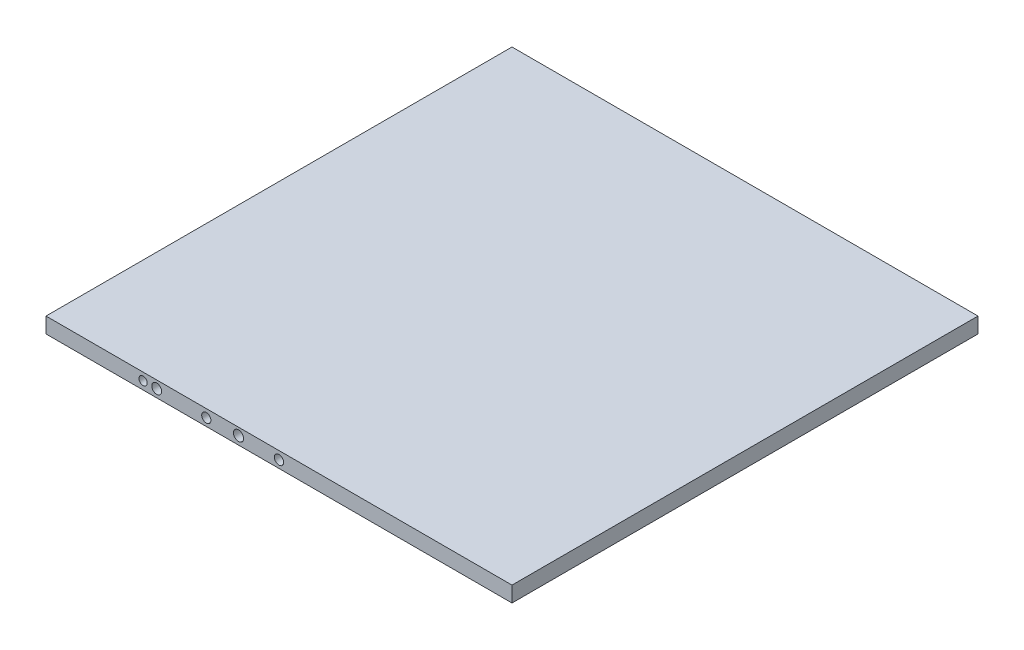
ISO-10303-21;
HEADER;
FILE_DESCRIPTION(('STEP AP214'),'2;1');
FILE_NAME('part.step','',(''),(''),'','','');
FILE_SCHEMA(('AUTOMOTIVE_DESIGN { 1 0 10303 214 1 1 1 1 }'));
ENDSEC;
DATA;
#1=APPLICATION_CONTEXT('core data for automotive mechanical design processes');
#2=APPLICATION_PROTOCOL_DEFINITION('international standard','automotive_design',2000,#1);
#3=PRODUCT_CONTEXT('',#1,'mechanical');
#4=PRODUCT('Part','Part','',(#3));
#5=PRODUCT_RELATED_PRODUCT_CATEGORY('part','',(#4));
#6=PRODUCT_DEFINITION_FORMATION('','',#4);
#7=PRODUCT_DEFINITION_CONTEXT('part definition',#1,'design');
#8=PRODUCT_DEFINITION('design','',#6,#7);
#9=PRODUCT_DEFINITION_SHAPE('','',#8);
#10=(LENGTH_UNIT() NAMED_UNIT(*) SI_UNIT(.MILLI.,.METRE.));
#11=(NAMED_UNIT(*) PLANE_ANGLE_UNIT() SI_UNIT($,.RADIAN.));
#12=(NAMED_UNIT(*) SI_UNIT($,.STERADIAN.) SOLID_ANGLE_UNIT());
#13=UNCERTAINTY_MEASURE_WITH_UNIT(LENGTH_MEASURE(1.E-05),#10,'distance_accuracy_value','');
#14=(GEOMETRIC_REPRESENTATION_CONTEXT(3) GLOBAL_UNCERTAINTY_ASSIGNED_CONTEXT((#13)) GLOBAL_UNIT_ASSIGNED_CONTEXT((#10,
#11,#12)) REPRESENTATION_CONTEXT('',''));
#15=CARTESIAN_POINT('',(0.,0.,0.));
#16=DIRECTION('',(0.,0.,1.));
#17=DIRECTION('',(1.,0.,0.));
#18=AXIS2_PLACEMENT_3D('',#15,#16,#17);
#19=CARTESIAN_POINT('',(-159.521495327103,10.16,-154.299065420561));
#20=DIRECTION('',(1.,0.,0.));
#21=DIRECTION('',(0.,0.,-1.));
#22=AXIS2_PLACEMENT_3D('',#19,#20,#21);
#23=PLANE('',#22);
#24=DIRECTION('',(0.,0.,1.));
#25=VECTOR('',#24,1.);
#26=CARTESIAN_POINT('',(-159.521495327103,0.,-154.299065420561));
#27=LINE('',#26,#25);
#28=CARTESIAN_POINT('',(-159.521495327103,0.,-154.299065420561));
#29=VERTEX_POINT('',#28);
#30=CARTESIAN_POINT('',(-159.521495327103,0.,150.500934579439));
#31=VERTEX_POINT('',#30);
#32=EDGE_CURVE('E99',#29,#31,#27,.T.);
#33=ORIENTED_EDGE('',*,*,#32,.T.);
#34=DIRECTION('',(0.,-1.,0.));
#35=VECTOR('',#34,1.);
#36=CARTESIAN_POINT('',(-159.521495327103,10.16,150.500934579439));
#37=LINE('',#36,#35);
#38=CARTESIAN_POINT('',(-159.521495327103,10.16,150.500934579439));
#39=VERTEX_POINT('',#38);
#40=EDGE_CURVE('E11',#39,#31,#37,.T.);
#41=ORIENTED_EDGE('',*,*,#40,.F.);
#42=DIRECTION('',(0.,0.,1.));
#43=VECTOR('',#42,1.);
#44=CARTESIAN_POINT('',(-159.521495327103,10.16,-154.299065420561));
#45=LINE('',#44,#43);
#46=CARTESIAN_POINT('',(-159.521495327103,10.16,-154.299065420561));
#47=VERTEX_POINT('',#46);
#48=EDGE_CURVE('E87',#47,#39,#45,.T.);
#49=ORIENTED_EDGE('',*,*,#48,.F.);
#50=DIRECTION('',(0.,-1.,0.));
#51=VECTOR('',#50,1.);
#52=CARTESIAN_POINT('',(-159.521495327103,10.16,-154.299065420561));
#53=LINE('',#52,#51);
#54=EDGE_CURVE('E95',#47,#29,#53,.T.);
#55=ORIENTED_EDGE('',*,*,#54,.T.);
#56=EDGE_LOOP('',(#33,#41,#49,#55));
#57=FACE_BOUND('',#56,.T.);
#58=ADVANCED_FACE('F36',(#57),#23,.F.);
#59=CARTESIAN_POINT('',(-159.521495327103,10.16,150.500934579439));
#60=DIRECTION('',(0.,0.,-1.));
#61=DIRECTION('',(-1.,0.,0.));
#62=AXIS2_PLACEMENT_3D('',#59,#60,#61);
#63=PLANE('',#62);
#64=CARTESIAN_POINT('',(-96.0214953271028,5.2184036671133,150.500934579439));
#65=DIRECTION('',(0.,0.,1.));
#66=DIRECTION('',(1.,0.,0.));
#67=AXIS2_PLACEMENT_3D('',#64,#65,#66);
#68=CIRCLE('',#67,2.70457170875124);
#69=CARTESIAN_POINT('',(-93.3169236183516,5.2184036671133,150.500934579439));
#70=VERTEX_POINT('',#69);
#71=EDGE_CURVE('E137',#70,#70,#68,.T.);
#72=ORIENTED_EDGE('',*,*,#71,.F.);
#73=EDGE_LOOP('',(#72));
#74=FACE_BOUND('',#73,.T.);
#75=CARTESIAN_POINT('',(-54.6794852296002,4.94175002935322,150.500934579439));
#76=DIRECTION('',(0.,0.,-1.));
#77=DIRECTION('',(-1.,0.,0.));
#78=AXIS2_PLACEMENT_3D('',#75,#76,#77);
#79=CIRCLE('',#78,3.);
#80=CARTESIAN_POINT('',(-51.6794852296002,4.94175002935322,150.500934579439));
#81=VERTEX_POINT('',#80);
#82=EDGE_CURVE('E130',#81,#81,#79,.T.);
#83=ORIENTED_EDGE('',*,*,#82,.T.);
#84=EDGE_LOOP('',(#83));
#85=FACE_BOUND('',#84,.T.);
#86=CARTESIAN_POINT('',(-33.5863044019541,5.33446931802849,150.500934579439));
#87=DIRECTION('',(0.,0.,-1.));
#88=DIRECTION('',(-1.,0.,0.));
#89=AXIS2_PLACEMENT_3D('',#86,#87,#88);
#90=CIRCLE('',#89,3.30810113435642);
#91=CARTESIAN_POINT('',(-30.2782032675976,5.33446931802849,150.500934579439));
#92=VERTEX_POINT('',#91);
#93=EDGE_CURVE('E122',#92,#92,#90,.T.);
#94=ORIENTED_EDGE('',*,*,#93,.T.);
#95=EDGE_LOOP('',(#94));
#96=FACE_BOUND('',#95,.T.);
#97=CARTESIAN_POINT('',(-87.1188149179639,5.2184036671133,150.500934579439));
#98=DIRECTION('',(0.,0.,1.));
#99=DIRECTION('',(1.,0.,0.));
#100=AXIS2_PLACEMENT_3D('',#97,#98,#99);
#101=CIRCLE('',#100,3.22810050000606);
#102=CARTESIAN_POINT('',(-83.8907144179578,5.2184036671133,150.500934579439));
#103=VERTEX_POINT('',#102);
#104=EDGE_CURVE('E119',#103,#103,#101,.T.);
#105=ORIENTED_EDGE('',*,*,#104,.F.);
#106=EDGE_LOOP('',(#105));
#107=FACE_BOUND('',#106,.T.);
#108=CARTESIAN_POINT('',(-7.12149532710285,4.94175002935322,150.500934579439));
#109=DIRECTION('',(0.,0.,1.));
#110=DIRECTION('',(1.,0.,0.));
#111=AXIS2_PLACEMENT_3D('',#108,#109,#110);
#112=CIRCLE('',#111,3.04);
#113=CARTESIAN_POINT('',(-4.08149532710285,4.94175002935322,150.500934579439));
#114=VERTEX_POINT('',#113);
#115=EDGE_CURVE('E115',#114,#114,#112,.T.);
#116=ORIENTED_EDGE('',*,*,#115,.F.);
#117=EDGE_LOOP('',(#116));
#118=FACE_BOUND('',#117,.T.);
#119=DIRECTION('',(1.,0.,0.));
#120=VECTOR('',#119,1.);
#121=CARTESIAN_POINT('',(-159.521495327103,0.,150.500934579439));
#122=LINE('',#121,#120);
#123=CARTESIAN_POINT('',(145.278504672897,0.,150.500934579439));
#124=VERTEX_POINT('',#123);
#125=EDGE_CURVE('E91',#31,#124,#122,.T.);
#126=ORIENTED_EDGE('',*,*,#125,.T.);
#127=DIRECTION('',(0.,-1.,0.));
#128=VECTOR('',#127,1.);
#129=CARTESIAN_POINT('',(145.278504672897,10.16,150.500934579439));
#130=LINE('',#129,#128);
#131=CARTESIAN_POINT('',(145.278504672897,10.16,150.500934579439));
#132=VERTEX_POINT('',#131);
#133=EDGE_CURVE('E44',#132,#124,#130,.T.);
#134=ORIENTED_EDGE('',*,*,#133,.F.);
#135=DIRECTION('',(1.,0.,0.));
#136=VECTOR('',#135,1.);
#137=CARTESIAN_POINT('',(-159.521495327103,10.16,150.500934579439));
#138=LINE('',#137,#136);
#139=EDGE_CURVE('E82',#39,#132,#138,.T.);
#140=ORIENTED_EDGE('',*,*,#139,.F.);
#141=ORIENTED_EDGE('',*,*,#40,.T.);
#142=EDGE_LOOP('',(#126,#134,#140,#141));
#143=FACE_BOUND('',#142,.T.);
#144=ADVANCED_FACE('F90',(#74,#85,#96,#107,#118,#143),#63,.F.);
#145=CARTESIAN_POINT('',(145.278504672897,10.16,-154.299065420561));
#146=DIRECTION('',(-1.,0.,0.));
#147=DIRECTION('',(0.,0.,1.));
#148=AXIS2_PLACEMENT_3D('',#145,#146,#147);
#149=PLANE('',#148);
#150=DIRECTION('',(0.,0.,-1.));
#151=VECTOR('',#150,1.);
#152=CARTESIAN_POINT('',(145.278504672897,0.,-154.299065420561));
#153=LINE('',#152,#151);
#154=CARTESIAN_POINT('',(145.278504672897,0.,-154.299065420561));
#155=VERTEX_POINT('',#154);
#156=EDGE_CURVE('E69',#124,#155,#153,.T.);
#157=ORIENTED_EDGE('',*,*,#156,.T.);
#158=DIRECTION('',(0.,-1.,0.));
#159=VECTOR('',#158,1.);
#160=CARTESIAN_POINT('',(145.278504672897,10.16,-154.299065420561));
#161=LINE('',#160,#159);
#162=CARTESIAN_POINT('',(145.278504672897,10.16,-154.299065420561));
#163=VERTEX_POINT('',#162);
#164=EDGE_CURVE('E92',#163,#155,#161,.T.);
#165=ORIENTED_EDGE('',*,*,#164,.F.);
#166=DIRECTION('',(0.,0.,-1.));
#167=VECTOR('',#166,1.);
#168=CARTESIAN_POINT('',(145.278504672897,10.16,-154.299065420561));
#169=LINE('',#168,#167);
#170=EDGE_CURVE('E85',#132,#163,#169,.T.);
#171=ORIENTED_EDGE('',*,*,#170,.F.);
#172=ORIENTED_EDGE('',*,*,#133,.T.);
#173=EDGE_LOOP('',(#157,#165,#171,#172));
#174=FACE_BOUND('',#173,.T.);
#175=ADVANCED_FACE('F93',(#174),#149,.F.);
#176=CARTESIAN_POINT('',(-159.521495327103,10.16,-154.299065420561));
#177=DIRECTION('',(0.,0.,1.));
#178=DIRECTION('',(1.,0.,0.));
#179=AXIS2_PLACEMENT_3D('',#176,#177,#178);
#180=PLANE('',#179);
#181=CARTESIAN_POINT('',(-96.0214953271028,5.2184036671133,-154.299065420561));
#182=DIRECTION('',(0.,0.,1.));
#183=DIRECTION('',(1.,0.,0.));
#184=AXIS2_PLACEMENT_3D('',#181,#182,#183);
#185=CIRCLE('',#184,2.70457170875124);
#186=CARTESIAN_POINT('',(-93.3169236183516,5.2184036671133,-154.299065420561));
#187=VERTEX_POINT('',#186);
#188=EDGE_CURVE('E136',#187,#187,#185,.T.);
#189=ORIENTED_EDGE('',*,*,#188,.T.);
#190=EDGE_LOOP('',(#189));
#191=FACE_BOUND('',#190,.T.);
#192=CARTESIAN_POINT('',(-54.6794852296002,4.94175002935322,-154.299065420561));
#193=DIRECTION('',(0.,0.,1.));
#194=DIRECTION('',(1.,0.,0.));
#195=AXIS2_PLACEMENT_3D('',#192,#193,#194);
#196=CIRCLE('',#195,3.);
#197=CARTESIAN_POINT('',(-51.6794852296002,4.94175002935322,-154.299065420561));
#198=VERTEX_POINT('',#197);
#199=EDGE_CURVE('E133',#198,#198,#196,.T.);
#200=ORIENTED_EDGE('',*,*,#199,.T.);
#201=EDGE_LOOP('',(#200));
#202=FACE_BOUND('',#201,.T.);
#203=CARTESIAN_POINT('',(-33.5863044019541,5.33446931802849,-154.299065420561));
#204=DIRECTION('',(0.,0.,1.));
#205=DIRECTION('',(1.,0.,0.));
#206=AXIS2_PLACEMENT_3D('',#203,#204,#205);
#207=CIRCLE('',#206,3.30810113435642);
#208=CARTESIAN_POINT('',(-30.2782032675976,5.33446931802849,-154.299065420561));
#209=VERTEX_POINT('',#208);
#210=EDGE_CURVE('E127',#209,#209,#207,.T.);
#211=ORIENTED_EDGE('',*,*,#210,.T.);
#212=EDGE_LOOP('',(#211));
#213=FACE_BOUND('',#212,.T.);
#214=CARTESIAN_POINT('',(-87.1188149179639,5.2184036671133,-154.299065420561));
#215=DIRECTION('',(0.,0.,1.));
#216=DIRECTION('',(1.,0.,0.));
#217=AXIS2_PLACEMENT_3D('',#214,#215,#216);
#218=CIRCLE('',#217,3.22810050000606);
#219=CARTESIAN_POINT('',(-83.8907144179578,5.2184036671133,-154.299065420561));
#220=VERTEX_POINT('',#219);
#221=EDGE_CURVE('E118',#220,#220,#218,.T.);
#222=ORIENTED_EDGE('',*,*,#221,.T.);
#223=EDGE_LOOP('',(#222));
#224=FACE_BOUND('',#223,.T.);
#225=CARTESIAN_POINT('',(-7.12149532710285,4.94175002935322,-154.299065420561));
#226=DIRECTION('',(0.,0.,1.));
#227=DIRECTION('',(1.,0.,0.));
#228=AXIS2_PLACEMENT_3D('',#225,#226,#227);
#229=CIRCLE('',#228,3.04);
#230=CARTESIAN_POINT('',(-4.08149532710285,4.94175002935322,-154.299065420561));
#231=VERTEX_POINT('',#230);
#232=EDGE_CURVE('E102',#231,#231,#229,.T.);
#233=ORIENTED_EDGE('',*,*,#232,.T.);
#234=EDGE_LOOP('',(#233));
#235=FACE_BOUND('',#234,.T.);
#236=DIRECTION('',(-1.,0.,0.));
#237=VECTOR('',#236,1.);
#238=CARTESIAN_POINT('',(-159.521495327103,0.,-154.299065420561));
#239=LINE('',#238,#237);
#240=EDGE_CURVE('E75',#155,#29,#239,.T.);
#241=ORIENTED_EDGE('',*,*,#240,.T.);
#242=ORIENTED_EDGE('',*,*,#54,.F.);
#243=DIRECTION('',(-1.,0.,0.));
#244=VECTOR('',#243,1.);
#245=CARTESIAN_POINT('',(-159.521495327103,10.16,-154.299065420561));
#246=LINE('',#245,#244);
#247=EDGE_CURVE('E52',#163,#47,#246,.T.);
#248=ORIENTED_EDGE('',*,*,#247,.F.);
#249=ORIENTED_EDGE('',*,*,#164,.T.);
#250=EDGE_LOOP('',(#241,#242,#248,#249));
#251=FACE_BOUND('',#250,.T.);
#252=ADVANCED_FACE('F107',(#191,#202,#213,#224,#235,#251),#180,.F.);
#253=CARTESIAN_POINT('',(0.,10.16,0.));
#254=DIRECTION('',(0.,1.,0.));
#255=DIRECTION('',(0.,0.,1.));
#256=AXIS2_PLACEMENT_3D('',#253,#254,#255);
#257=PLANE('',#256);
#258=ORIENTED_EDGE('',*,*,#48,.T.);
#259=ORIENTED_EDGE('',*,*,#139,.T.);
#260=ORIENTED_EDGE('',*,*,#170,.T.);
#261=ORIENTED_EDGE('',*,*,#247,.T.);
#262=EDGE_LOOP('',(#258,#259,#260,#261));
#263=FACE_BOUND('',#262,.T.);
#264=ADVANCED_FACE('F83',(#263),#257,.T.);
#265=CARTESIAN_POINT('',(0.,0.,0.));
#266=DIRECTION('',(0.,1.,0.));
#267=DIRECTION('',(0.,0.,1.));
#268=AXIS2_PLACEMENT_3D('',#265,#266,#267);
#269=PLANE('',#268);
#270=ORIENTED_EDGE('',*,*,#32,.F.);
#271=ORIENTED_EDGE('',*,*,#240,.F.);
#272=ORIENTED_EDGE('',*,*,#156,.F.);
#273=ORIENTED_EDGE('',*,*,#125,.F.);
#274=EDGE_LOOP('',(#270,#271,#272,#273));
#275=FACE_BOUND('',#274,.T.);
#276=ADVANCED_FACE('F110',(#275),#269,.F.);
#277=CARTESIAN_POINT('',(-7.12149532710285,4.94175002935322,-154.299065420561));
#278=DIRECTION('',(0.,0.,1.));
#279=DIRECTION('',(1.,0.,0.));
#280=AXIS2_PLACEMENT_3D('',#277,#278,#279);
#281=CYLINDRICAL_SURFACE('',#280,3.04);
#282=ORIENTED_EDGE('',*,*,#232,.F.);
#283=EDGE_LOOP('',(#282));
#284=FACE_BOUND('',#283,.T.);
#285=ORIENTED_EDGE('',*,*,#115,.T.);
#286=EDGE_LOOP('',(#285));
#287=FACE_BOUND('',#286,.T.);
#288=ADVANCED_FACE('F162',(#284,#287),#281,.F.);
#289=CARTESIAN_POINT('',(-87.1188149179639,5.2184036671133,-154.299065420561));
#290=DIRECTION('',(0.,0.,1.));
#291=DIRECTION('',(1.,0.,0.));
#292=AXIS2_PLACEMENT_3D('',#289,#290,#291);
#293=CYLINDRICAL_SURFACE('',#292,3.22810050000606);
#294=CARTESIAN_POINT('',(-83.8907144179578,5.2184036671133,-154.299065420561));
#295=CARTESIAN_POINT('',(-83.8907144179578,5.2184036671133,-151.124065420561));
#296=CARTESIAN_POINT('',(-83.8907144179578,5.2184036671133,-147.949065420561));
#297=CARTESIAN_POINT('',(-83.8907144179578,5.2184036671133,-141.599065420561));
#298=CARTESIAN_POINT('',(-83.8907144179578,5.2184036671133,-138.424065420561));
#299=CARTESIAN_POINT('',(-83.8907144179578,5.2184036671133,-132.074065420561));
#300=CARTESIAN_POINT('',(-83.8907144179578,5.2184036671133,-128.899065420561));
#301=CARTESIAN_POINT('',(-83.8907144179578,5.2184036671133,-122.549065420561));
#302=CARTESIAN_POINT('',(-83.8907144179578,5.2184036671133,-119.374065420561));
#303=CARTESIAN_POINT('',(-83.8907144179578,5.2184036671133,-113.024065420561));
#304=CARTESIAN_POINT('',(-83.8907144179578,5.2184036671133,-109.849065420561));
#305=CARTESIAN_POINT('',(-83.8907144179578,5.2184036671133,-103.499065420561));
#306=CARTESIAN_POINT('',(-83.8907144179578,5.2184036671133,-100.324065420561));
#307=CARTESIAN_POINT('',(-83.8907144179578,5.2184036671133,-93.9740654205608));
#308=CARTESIAN_POINT('',(-83.8907144179578,5.2184036671133,-90.7990654205608));
#309=CARTESIAN_POINT('',(-83.8907144179578,5.2184036671133,-84.4490654205608));
#310=CARTESIAN_POINT('',(-83.8907144179578,5.2184036671133,-81.2740654205608));
#311=CARTESIAN_POINT('',(-83.8907144179578,5.2184036671133,-74.9240654205608));
#312=CARTESIAN_POINT('',(-83.8907144179578,5.2184036671133,-71.7490654205608));
#313=CARTESIAN_POINT('',(-83.8907144179578,5.2184036671133,-65.3990654205608));
#314=CARTESIAN_POINT('',(-83.8907144179578,5.2184036671133,-62.2240654205608));
#315=CARTESIAN_POINT('',(-83.8907144179578,5.2184036671133,-55.8740654205608));
#316=CARTESIAN_POINT('',(-83.8907144179578,5.2184036671133,-52.6990654205608));
#317=CARTESIAN_POINT('',(-83.8907144179578,5.2184036671133,-46.3490654205608));
#318=CARTESIAN_POINT('',(-83.8907144179578,5.2184036671133,-43.1740654205608));
#319=CARTESIAN_POINT('',(-83.8907144179578,5.2184036671133,-36.8240654205608));
#320=CARTESIAN_POINT('',(-83.8907144179578,5.2184036671133,-33.6490654205608));
#321=CARTESIAN_POINT('',(-83.8907144179578,5.2184036671133,-27.2990654205608));
#322=CARTESIAN_POINT('',(-83.8907144179578,5.2184036671133,-24.1240654205608));
#323=CARTESIAN_POINT('',(-83.8907144179578,5.2184036671133,-17.7740654205608));
#324=CARTESIAN_POINT('',(-83.8907144179578,5.2184036671133,-14.5990654205608));
#325=CARTESIAN_POINT('',(-83.8907144179578,5.2184036671133,-8.24906542056082));
#326=CARTESIAN_POINT('',(-83.8907144179578,5.2184036671133,-5.07406542056082));
#327=CARTESIAN_POINT('',(-83.8907144179578,5.2184036671133,1.27593457943919));
#328=CARTESIAN_POINT('',(-83.8907144179578,5.2184036671133,4.45093457943919));
#329=CARTESIAN_POINT('',(-83.8907144179578,5.2184036671133,10.8009345794392));
#330=CARTESIAN_POINT('',(-83.8907144179578,5.2184036671133,13.9759345794392));
#331=CARTESIAN_POINT('',(-83.8907144179578,5.2184036671133,20.3259345794392));
#332=CARTESIAN_POINT('',(-83.8907144179578,5.2184036671133,23.5009345794392));
#333=CARTESIAN_POINT('',(-83.8907144179578,5.2184036671133,29.8509345794392));
#334=CARTESIAN_POINT('',(-83.8907144179578,5.2184036671133,33.0259345794392));
#335=CARTESIAN_POINT('',(-83.8907144179578,5.2184036671133,39.3759345794392));
#336=CARTESIAN_POINT('',(-83.8907144179578,5.2184036671133,42.5509345794392));
#337=CARTESIAN_POINT('',(-83.8907144179578,5.2184036671133,48.9009345794392));
#338=CARTESIAN_POINT('',(-83.8907144179578,5.2184036671133,52.0759345794392));
#339=CARTESIAN_POINT('',(-83.8907144179578,5.2184036671133,58.4259345794392));
#340=CARTESIAN_POINT('',(-83.8907144179578,5.2184036671133,61.6009345794392));
#341=CARTESIAN_POINT('',(-83.8907144179578,5.2184036671133,67.9509345794392));
#342=CARTESIAN_POINT('',(-83.8907144179578,5.2184036671133,71.1259345794392));
#343=CARTESIAN_POINT('',(-83.8907144179578,5.2184036671133,77.4759345794392));
#344=CARTESIAN_POINT('',(-83.8907144179578,5.2184036671133,80.6509345794392));
#345=CARTESIAN_POINT('',(-83.8907144179578,5.2184036671133,87.0009345794392));
#346=CARTESIAN_POINT('',(-83.8907144179578,5.2184036671133,90.1759345794392));
#347=CARTESIAN_POINT('',(-83.8907144179578,5.2184036671133,96.5259345794392));
#348=CARTESIAN_POINT('',(-83.8907144179578,5.2184036671133,99.7009345794392));
#349=CARTESIAN_POINT('',(-83.8907144179578,5.2184036671133,106.050934579439));
#350=CARTESIAN_POINT('',(-83.8907144179578,5.2184036671133,109.225934579439));
#351=CARTESIAN_POINT('',(-83.8907144179578,5.2184036671133,115.575934579439));
#352=CARTESIAN_POINT('',(-83.8907144179578,5.2184036671133,118.750934579439));
#353=CARTESIAN_POINT('',(-83.8907144179578,5.2184036671133,125.100934579439));
#354=CARTESIAN_POINT('',(-83.8907144179578,5.2184036671133,128.275934579439));
#355=CARTESIAN_POINT('',(-83.8907144179578,5.2184036671133,134.625934579439));
#356=CARTESIAN_POINT('',(-83.8907144179578,5.2184036671133,137.800934579439));
#357=CARTESIAN_POINT('',(-83.8907144179578,5.2184036671133,144.150934579439));
#358=CARTESIAN_POINT('',(-83.8907144179578,5.2184036671133,147.325934579439));
#359=CARTESIAN_POINT('',(-83.8907144179578,5.2184036671133,150.500934579439));
#360=B_SPLINE_CURVE_WITH_KNOTS('',3,(#294,#295,#296,#297,#298,#299,#300,#301,#302,#303,#304,
#305,#306,#307,#308,#309,#310,#311,#312,#313,#314,#315,#316,#317,#318,#319,#320,#321,#322,#323,
#324,#325,#326,#327,#328,#329,#330,#331,#332,#333,#334,#335,#336,#337,#338,#339,#340,#341,#342,
#343,#344,#345,#346,#347,#348,#349,#350,#351,#352,#353,#354,#355,#356,#357,#358,#359),
.UNSPECIFIED.,.F.,.F.,(4,2,2,2,2,2,2,2,2,2,2,2,2,2,2,2,2,2,2,2,2,2,2,2,2,2,2,2,2,2,2,2,4),(0.,
9.52500000000001,19.05,28.575,38.1,47.625,57.15,66.675,76.2,85.725,95.25,104.775,114.3,123.825,
133.35,142.875,152.4,161.925,171.45,180.975,190.5,200.025,209.55,219.075,228.6,238.125,247.65,
257.175,266.7,276.225,285.75,295.275,304.8),.UNSPECIFIED.);
#361=EDGE_CURVE('BSEAM164',#220,#103,#360,.T.);
#362=ORIENTED_EDGE('',*,*,#221,.F.);
#363=ORIENTED_EDGE('',*,*,#104,.T.);
#364=ORIENTED_EDGE('',*,*,#361,.T.);
#365=ORIENTED_EDGE('',*,*,#361,.F.);
#366=EDGE_LOOP('',(#362,#364,#363,#365));
#367=FACE_BOUND('',#366,.T.);
#368=ADVANCED_FACE('F164',(#367),#293,.F.);
#369=CARTESIAN_POINT('',(-33.5863044019541,5.33446931802849,-154.299065420561));
#370=DIRECTION('',(0.,0.,1.));
#371=DIRECTION('',(1.,0.,0.));
#372=AXIS2_PLACEMENT_3D('',#369,#370,#371);
#373=CYLINDRICAL_SURFACE('',#372,3.30810113435642);
#374=CARTESIAN_POINT('',(-30.2782032675976,5.33446931802849,-154.299065420561));
#375=CARTESIAN_POINT('',(-30.2782032675976,5.33446931802849,-151.124065420561));
#376=CARTESIAN_POINT('',(-30.2782032675976,5.33446931802849,-147.949065420561));
#377=CARTESIAN_POINT('',(-30.2782032675976,5.33446931802849,-141.599065420561));
#378=CARTESIAN_POINT('',(-30.2782032675976,5.33446931802849,-138.424065420561));
#379=CARTESIAN_POINT('',(-30.2782032675976,5.33446931802849,-132.074065420561));
#380=CARTESIAN_POINT('',(-30.2782032675976,5.33446931802849,-128.899065420561));
#381=CARTESIAN_POINT('',(-30.2782032675976,5.33446931802849,-122.549065420561));
#382=CARTESIAN_POINT('',(-30.2782032675976,5.33446931802849,-119.374065420561));
#383=CARTESIAN_POINT('',(-30.2782032675976,5.33446931802849,-113.024065420561));
#384=CARTESIAN_POINT('',(-30.2782032675976,5.33446931802849,-109.849065420561));
#385=CARTESIAN_POINT('',(-30.2782032675976,5.33446931802849,-103.499065420561));
#386=CARTESIAN_POINT('',(-30.2782032675976,5.33446931802849,-100.324065420561));
#387=CARTESIAN_POINT('',(-30.2782032675976,5.33446931802849,-93.9740654205608));
#388=CARTESIAN_POINT('',(-30.2782032675976,5.33446931802849,-90.7990654205608));
#389=CARTESIAN_POINT('',(-30.2782032675976,5.33446931802849,-84.4490654205608));
#390=CARTESIAN_POINT('',(-30.2782032675976,5.33446931802849,-81.2740654205608));
#391=CARTESIAN_POINT('',(-30.2782032675976,5.33446931802849,-74.9240654205608));
#392=CARTESIAN_POINT('',(-30.2782032675976,5.33446931802849,-71.7490654205608));
#393=CARTESIAN_POINT('',(-30.2782032675976,5.33446931802849,-65.3990654205608));
#394=CARTESIAN_POINT('',(-30.2782032675976,5.33446931802849,-62.2240654205608));
#395=CARTESIAN_POINT('',(-30.2782032675976,5.33446931802849,-55.8740654205608));
#396=CARTESIAN_POINT('',(-30.2782032675976,5.33446931802849,-52.6990654205608));
#397=CARTESIAN_POINT('',(-30.2782032675976,5.33446931802849,-46.3490654205608));
#398=CARTESIAN_POINT('',(-30.2782032675976,5.33446931802849,-43.1740654205608));
#399=CARTESIAN_POINT('',(-30.2782032675976,5.33446931802849,-36.8240654205608));
#400=CARTESIAN_POINT('',(-30.2782032675976,5.33446931802849,-33.6490654205608));
#401=CARTESIAN_POINT('',(-30.2782032675976,5.33446931802849,-27.2990654205608));
#402=CARTESIAN_POINT('',(-30.2782032675976,5.33446931802849,-24.1240654205608));
#403=CARTESIAN_POINT('',(-30.2782032675976,5.33446931802849,-17.7740654205608));
#404=CARTESIAN_POINT('',(-30.2782032675976,5.33446931802849,-14.5990654205608));
#405=CARTESIAN_POINT('',(-30.2782032675976,5.33446931802849,-8.24906542056082));
#406=CARTESIAN_POINT('',(-30.2782032675976,5.33446931802849,-5.07406542056082));
#407=CARTESIAN_POINT('',(-30.2782032675976,5.33446931802849,1.27593457943919));
#408=CARTESIAN_POINT('',(-30.2782032675976,5.33446931802849,4.45093457943919));
#409=CARTESIAN_POINT('',(-30.2782032675976,5.33446931802849,10.8009345794392));
#410=CARTESIAN_POINT('',(-30.2782032675976,5.33446931802849,13.9759345794392));
#411=CARTESIAN_POINT('',(-30.2782032675976,5.33446931802849,20.3259345794392));
#412=CARTESIAN_POINT('',(-30.2782032675976,5.33446931802849,23.5009345794392));
#413=CARTESIAN_POINT('',(-30.2782032675976,5.33446931802849,29.8509345794392));
#414=CARTESIAN_POINT('',(-30.2782032675976,5.33446931802849,33.0259345794392));
#415=CARTESIAN_POINT('',(-30.2782032675976,5.33446931802849,39.3759345794392));
#416=CARTESIAN_POINT('',(-30.2782032675976,5.33446931802849,42.5509345794392));
#417=CARTESIAN_POINT('',(-30.2782032675976,5.33446931802849,48.9009345794392));
#418=CARTESIAN_POINT('',(-30.2782032675976,5.33446931802849,52.0759345794392));
#419=CARTESIAN_POINT('',(-30.2782032675976,5.33446931802849,58.4259345794392));
#420=CARTESIAN_POINT('',(-30.2782032675976,5.33446931802849,61.6009345794392));
#421=CARTESIAN_POINT('',(-30.2782032675976,5.33446931802849,67.9509345794392));
#422=CARTESIAN_POINT('',(-30.2782032675976,5.33446931802849,71.1259345794392));
#423=CARTESIAN_POINT('',(-30.2782032675976,5.33446931802849,77.4759345794392));
#424=CARTESIAN_POINT('',(-30.2782032675976,5.33446931802849,80.6509345794392));
#425=CARTESIAN_POINT('',(-30.2782032675976,5.33446931802849,87.0009345794392));
#426=CARTESIAN_POINT('',(-30.2782032675976,5.33446931802849,90.1759345794392));
#427=CARTESIAN_POINT('',(-30.2782032675976,5.33446931802849,96.5259345794392));
#428=CARTESIAN_POINT('',(-30.2782032675976,5.33446931802849,99.7009345794392));
#429=CARTESIAN_POINT('',(-30.2782032675976,5.33446931802849,106.050934579439));
#430=CARTESIAN_POINT('',(-30.2782032675976,5.33446931802849,109.225934579439));
#431=CARTESIAN_POINT('',(-30.2782032675976,5.33446931802849,115.575934579439));
#432=CARTESIAN_POINT('',(-30.2782032675976,5.33446931802849,118.750934579439));
#433=CARTESIAN_POINT('',(-30.2782032675976,5.33446931802849,125.100934579439));
#434=CARTESIAN_POINT('',(-30.2782032675976,5.33446931802849,128.275934579439));
#435=CARTESIAN_POINT('',(-30.2782032675976,5.33446931802849,134.625934579439));
#436=CARTESIAN_POINT('',(-30.2782032675976,5.33446931802849,137.800934579439));
#437=CARTESIAN_POINT('',(-30.2782032675976,5.33446931802849,144.150934579439));
#438=CARTESIAN_POINT('',(-30.2782032675976,5.33446931802849,147.325934579439));
#439=CARTESIAN_POINT('',(-30.2782032675976,5.33446931802849,150.500934579439));
#440=B_SPLINE_CURVE_WITH_KNOTS('',3,(#374,#375,#376,#377,#378,#379,#380,#381,#382,#383,#384,
#385,#386,#387,#388,#389,#390,#391,#392,#393,#394,#395,#396,#397,#398,#399,#400,#401,#402,#403,
#404,#405,#406,#407,#408,#409,#410,#411,#412,#413,#414,#415,#416,#417,#418,#419,#420,#421,#422,
#423,#424,#425,#426,#427,#428,#429,#430,#431,#432,#433,#434,#435,#436,#437,#438,#439),
.UNSPECIFIED.,.F.,.F.,(4,2,2,2,2,2,2,2,2,2,2,2,2,2,2,2,2,2,2,2,2,2,2,2,2,2,2,2,2,2,2,2,4),(0.,
9.52500000000001,19.05,28.575,38.1,47.625,57.15,66.675,76.2,85.725,95.25,104.775,114.3,123.825,
133.35,142.875,152.4,161.925,171.45,180.975,190.5,200.025,209.55,219.075,228.6,238.125,247.65,
257.175,266.7,276.225,285.75,295.275,304.8),.UNSPECIFIED.);
#441=EDGE_CURVE('BSEAM171',#209,#92,#440,.T.);
#442=ORIENTED_EDGE('',*,*,#210,.F.);
#443=ORIENTED_EDGE('',*,*,#93,.F.);
#444=ORIENTED_EDGE('',*,*,#441,.T.);
#445=ORIENTED_EDGE('',*,*,#441,.F.);
#446=EDGE_LOOP('',(#442,#444,#443,#445));
#447=FACE_BOUND('',#446,.T.);
#448=ADVANCED_FACE('F171',(#447),#373,.F.);
#449=CARTESIAN_POINT('',(-54.6794852296002,4.94175002935322,-154.299065420561));
#450=DIRECTION('',(0.,0.,1.));
#451=DIRECTION('',(1.,0.,0.));
#452=AXIS2_PLACEMENT_3D('',#449,#450,#451);
#453=CYLINDRICAL_SURFACE('',#452,3.);
#454=CARTESIAN_POINT('',(-51.6794852296002,4.94175002935322,-154.299065420561));
#455=CARTESIAN_POINT('',(-51.6794852296002,4.94175002935322,-151.124065420561));
#456=CARTESIAN_POINT('',(-51.6794852296002,4.94175002935322,-147.949065420561));
#457=CARTESIAN_POINT('',(-51.6794852296002,4.94175002935322,-141.599065420561));
#458=CARTESIAN_POINT('',(-51.6794852296002,4.94175002935322,-138.424065420561));
#459=CARTESIAN_POINT('',(-51.6794852296002,4.94175002935322,-132.074065420561));
#460=CARTESIAN_POINT('',(-51.6794852296002,4.94175002935322,-128.899065420561));
#461=CARTESIAN_POINT('',(-51.6794852296002,4.94175002935322,-122.549065420561));
#462=CARTESIAN_POINT('',(-51.6794852296002,4.94175002935322,-119.374065420561));
#463=CARTESIAN_POINT('',(-51.6794852296002,4.94175002935322,-113.024065420561));
#464=CARTESIAN_POINT('',(-51.6794852296002,4.94175002935322,-109.849065420561));
#465=CARTESIAN_POINT('',(-51.6794852296002,4.94175002935322,-103.499065420561));
#466=CARTESIAN_POINT('',(-51.6794852296002,4.94175002935322,-100.324065420561));
#467=CARTESIAN_POINT('',(-51.6794852296002,4.94175002935322,-93.9740654205608));
#468=CARTESIAN_POINT('',(-51.6794852296002,4.94175002935322,-90.7990654205608));
#469=CARTESIAN_POINT('',(-51.6794852296002,4.94175002935322,-84.4490654205608));
#470=CARTESIAN_POINT('',(-51.6794852296002,4.94175002935322,-81.2740654205608));
#471=CARTESIAN_POINT('',(-51.6794852296002,4.94175002935322,-74.9240654205608));
#472=CARTESIAN_POINT('',(-51.6794852296002,4.94175002935322,-71.7490654205608));
#473=CARTESIAN_POINT('',(-51.6794852296002,4.94175002935322,-65.3990654205608));
#474=CARTESIAN_POINT('',(-51.6794852296002,4.94175002935322,-62.2240654205608));
#475=CARTESIAN_POINT('',(-51.6794852296002,4.94175002935322,-55.8740654205608));
#476=CARTESIAN_POINT('',(-51.6794852296002,4.94175002935322,-52.6990654205608));
#477=CARTESIAN_POINT('',(-51.6794852296002,4.94175002935322,-46.3490654205608));
#478=CARTESIAN_POINT('',(-51.6794852296002,4.94175002935322,-43.1740654205608));
#479=CARTESIAN_POINT('',(-51.6794852296002,4.94175002935322,-36.8240654205608));
#480=CARTESIAN_POINT('',(-51.6794852296002,4.94175002935322,-33.6490654205608));
#481=CARTESIAN_POINT('',(-51.6794852296002,4.94175002935322,-27.2990654205608));
#482=CARTESIAN_POINT('',(-51.6794852296002,4.94175002935322,-24.1240654205608));
#483=CARTESIAN_POINT('',(-51.6794852296002,4.94175002935322,-17.7740654205608));
#484=CARTESIAN_POINT('',(-51.6794852296002,4.94175002935322,-14.5990654205608));
#485=CARTESIAN_POINT('',(-51.6794852296002,4.94175002935322,-8.24906542056082));
#486=CARTESIAN_POINT('',(-51.6794852296002,4.94175002935322,-5.07406542056082));
#487=CARTESIAN_POINT('',(-51.6794852296002,4.94175002935322,1.27593457943919));
#488=CARTESIAN_POINT('',(-51.6794852296002,4.94175002935322,4.45093457943919));
#489=CARTESIAN_POINT('',(-51.6794852296002,4.94175002935322,10.8009345794392));
#490=CARTESIAN_POINT('',(-51.6794852296002,4.94175002935322,13.9759345794392));
#491=CARTESIAN_POINT('',(-51.6794852296002,4.94175002935322,20.3259345794392));
#492=CARTESIAN_POINT('',(-51.6794852296002,4.94175002935322,23.5009345794392));
#493=CARTESIAN_POINT('',(-51.6794852296002,4.94175002935322,29.8509345794392));
#494=CARTESIAN_POINT('',(-51.6794852296002,4.94175002935322,33.0259345794392));
#495=CARTESIAN_POINT('',(-51.6794852296002,4.94175002935322,39.3759345794392));
#496=CARTESIAN_POINT('',(-51.6794852296002,4.94175002935322,42.5509345794392));
#497=CARTESIAN_POINT('',(-51.6794852296002,4.94175002935322,48.9009345794392));
#498=CARTESIAN_POINT('',(-51.6794852296002,4.94175002935322,52.0759345794392));
#499=CARTESIAN_POINT('',(-51.6794852296002,4.94175002935322,58.4259345794392));
#500=CARTESIAN_POINT('',(-51.6794852296002,4.94175002935322,61.6009345794392));
#501=CARTESIAN_POINT('',(-51.6794852296002,4.94175002935322,67.9509345794392));
#502=CARTESIAN_POINT('',(-51.6794852296002,4.94175002935322,71.1259345794392));
#503=CARTESIAN_POINT('',(-51.6794852296002,4.94175002935322,77.4759345794392));
#504=CARTESIAN_POINT('',(-51.6794852296002,4.94175002935322,80.6509345794392));
#505=CARTESIAN_POINT('',(-51.6794852296002,4.94175002935322,87.0009345794392));
#506=CARTESIAN_POINT('',(-51.6794852296002,4.94175002935322,90.1759345794392));
#507=CARTESIAN_POINT('',(-51.6794852296002,4.94175002935322,96.5259345794392));
#508=CARTESIAN_POINT('',(-51.6794852296002,4.94175002935322,99.7009345794392));
#509=CARTESIAN_POINT('',(-51.6794852296002,4.94175002935322,106.050934579439));
#510=CARTESIAN_POINT('',(-51.6794852296002,4.94175002935322,109.225934579439));
#511=CARTESIAN_POINT('',(-51.6794852296002,4.94175002935322,115.575934579439));
#512=CARTESIAN_POINT('',(-51.6794852296002,4.94175002935322,118.750934579439));
#513=CARTESIAN_POINT('',(-51.6794852296002,4.94175002935322,125.100934579439));
#514=CARTESIAN_POINT('',(-51.6794852296002,4.94175002935322,128.275934579439));
#515=CARTESIAN_POINT('',(-51.6794852296002,4.94175002935322,134.625934579439));
#516=CARTESIAN_POINT('',(-51.6794852296002,4.94175002935322,137.800934579439));
#517=CARTESIAN_POINT('',(-51.6794852296002,4.94175002935322,144.150934579439));
#518=CARTESIAN_POINT('',(-51.6794852296002,4.94175002935322,147.325934579439));
#519=CARTESIAN_POINT('',(-51.6794852296002,4.94175002935322,150.500934579439));
#520=B_SPLINE_CURVE_WITH_KNOTS('',3,(#454,#455,#456,#457,#458,#459,#460,#461,#462,#463,#464,
#465,#466,#467,#468,#469,#470,#471,#472,#473,#474,#475,#476,#477,#478,#479,#480,#481,#482,#483,
#484,#485,#486,#487,#488,#489,#490,#491,#492,#493,#494,#495,#496,#497,#498,#499,#500,#501,#502,
#503,#504,#505,#506,#507,#508,#509,#510,#511,#512,#513,#514,#515,#516,#517,#518,#519),
.UNSPECIFIED.,.F.,.F.,(4,2,2,2,2,2,2,2,2,2,2,2,2,2,2,2,2,2,2,2,2,2,2,2,2,2,2,2,2,2,2,2,4),(0.,
9.52500000000001,19.05,28.575,38.1,47.625,57.15,66.675,76.2,85.725,95.25,104.775,114.3,123.825,
133.35,142.875,152.4,161.925,171.45,180.975,190.5,200.025,209.55,219.075,228.6,238.125,247.65,
257.175,266.7,276.225,285.75,295.275,304.8),.UNSPECIFIED.);
#521=EDGE_CURVE('BSEAM148',#198,#81,#520,.T.);
#522=ORIENTED_EDGE('',*,*,#199,.F.);
#523=ORIENTED_EDGE('',*,*,#82,.F.);
#524=ORIENTED_EDGE('',*,*,#521,.T.);
#525=ORIENTED_EDGE('',*,*,#521,.F.);
#526=EDGE_LOOP('',(#522,#524,#523,#525));
#527=FACE_BOUND('',#526,.T.);
#528=ADVANCED_FACE('F148',(#527),#453,.F.);
#529=CARTESIAN_POINT('',(-96.0214953271028,5.2184036671133,-154.299065420561));
#530=DIRECTION('',(0.,0.,1.));
#531=DIRECTION('',(1.,0.,0.));
#532=AXIS2_PLACEMENT_3D('',#529,#530,#531);
#533=CYLINDRICAL_SURFACE('',#532,2.70457170875124);
#534=CARTESIAN_POINT('',(-93.3169236183516,5.2184036671133,-154.299065420561));
#535=CARTESIAN_POINT('',(-93.3169236183516,5.2184036671133,-151.124065420561));
#536=CARTESIAN_POINT('',(-93.3169236183516,5.2184036671133,-147.949065420561));
#537=CARTESIAN_POINT('',(-93.3169236183516,5.2184036671133,-141.599065420561));
#538=CARTESIAN_POINT('',(-93.3169236183516,5.2184036671133,-138.424065420561));
#539=CARTESIAN_POINT('',(-93.3169236183516,5.2184036671133,-132.074065420561));
#540=CARTESIAN_POINT('',(-93.3169236183516,5.2184036671133,-128.899065420561));
#541=CARTESIAN_POINT('',(-93.3169236183516,5.2184036671133,-122.549065420561));
#542=CARTESIAN_POINT('',(-93.3169236183516,5.2184036671133,-119.374065420561));
#543=CARTESIAN_POINT('',(-93.3169236183516,5.2184036671133,-113.024065420561));
#544=CARTESIAN_POINT('',(-93.3169236183516,5.2184036671133,-109.849065420561));
#545=CARTESIAN_POINT('',(-93.3169236183516,5.2184036671133,-103.499065420561));
#546=CARTESIAN_POINT('',(-93.3169236183516,5.2184036671133,-100.324065420561));
#547=CARTESIAN_POINT('',(-93.3169236183516,5.2184036671133,-93.9740654205608));
#548=CARTESIAN_POINT('',(-93.3169236183516,5.2184036671133,-90.7990654205608));
#549=CARTESIAN_POINT('',(-93.3169236183516,5.2184036671133,-84.4490654205608));
#550=CARTESIAN_POINT('',(-93.3169236183516,5.2184036671133,-81.2740654205608));
#551=CARTESIAN_POINT('',(-93.3169236183516,5.2184036671133,-74.9240654205608));
#552=CARTESIAN_POINT('',(-93.3169236183516,5.2184036671133,-71.7490654205608));
#553=CARTESIAN_POINT('',(-93.3169236183516,5.2184036671133,-65.3990654205608));
#554=CARTESIAN_POINT('',(-93.3169236183516,5.2184036671133,-62.2240654205608));
#555=CARTESIAN_POINT('',(-93.3169236183516,5.2184036671133,-55.8740654205608));
#556=CARTESIAN_POINT('',(-93.3169236183516,5.2184036671133,-52.6990654205608));
#557=CARTESIAN_POINT('',(-93.3169236183516,5.2184036671133,-46.3490654205608));
#558=CARTESIAN_POINT('',(-93.3169236183516,5.2184036671133,-43.1740654205608));
#559=CARTESIAN_POINT('',(-93.3169236183516,5.2184036671133,-36.8240654205608));
#560=CARTESIAN_POINT('',(-93.3169236183516,5.2184036671133,-33.6490654205608));
#561=CARTESIAN_POINT('',(-93.3169236183516,5.2184036671133,-27.2990654205608));
#562=CARTESIAN_POINT('',(-93.3169236183516,5.2184036671133,-24.1240654205608));
#563=CARTESIAN_POINT('',(-93.3169236183516,5.2184036671133,-17.7740654205608));
#564=CARTESIAN_POINT('',(-93.3169236183516,5.2184036671133,-14.5990654205608));
#565=CARTESIAN_POINT('',(-93.3169236183516,5.2184036671133,-8.24906542056082));
#566=CARTESIAN_POINT('',(-93.3169236183516,5.2184036671133,-5.07406542056082));
#567=CARTESIAN_POINT('',(-93.3169236183516,5.2184036671133,1.27593457943919));
#568=CARTESIAN_POINT('',(-93.3169236183516,5.2184036671133,4.45093457943919));
#569=CARTESIAN_POINT('',(-93.3169236183516,5.2184036671133,10.8009345794392));
#570=CARTESIAN_POINT('',(-93.3169236183516,5.2184036671133,13.9759345794392));
#571=CARTESIAN_POINT('',(-93.3169236183516,5.2184036671133,20.3259345794392));
#572=CARTESIAN_POINT('',(-93.3169236183516,5.2184036671133,23.5009345794392));
#573=CARTESIAN_POINT('',(-93.3169236183516,5.2184036671133,29.8509345794392));
#574=CARTESIAN_POINT('',(-93.3169236183516,5.2184036671133,33.0259345794392));
#575=CARTESIAN_POINT('',(-93.3169236183516,5.2184036671133,39.3759345794392));
#576=CARTESIAN_POINT('',(-93.3169236183516,5.2184036671133,42.5509345794392));
#577=CARTESIAN_POINT('',(-93.3169236183516,5.2184036671133,48.9009345794392));
#578=CARTESIAN_POINT('',(-93.3169236183516,5.2184036671133,52.0759345794392));
#579=CARTESIAN_POINT('',(-93.3169236183516,5.2184036671133,58.4259345794392));
#580=CARTESIAN_POINT('',(-93.3169236183516,5.2184036671133,61.6009345794392));
#581=CARTESIAN_POINT('',(-93.3169236183516,5.2184036671133,67.9509345794392));
#582=CARTESIAN_POINT('',(-93.3169236183516,5.2184036671133,71.1259345794392));
#583=CARTESIAN_POINT('',(-93.3169236183516,5.2184036671133,77.4759345794392));
#584=CARTESIAN_POINT('',(-93.3169236183516,5.2184036671133,80.6509345794392));
#585=CARTESIAN_POINT('',(-93.3169236183516,5.2184036671133,87.0009345794392));
#586=CARTESIAN_POINT('',(-93.3169236183516,5.2184036671133,90.1759345794392));
#587=CARTESIAN_POINT('',(-93.3169236183516,5.2184036671133,96.5259345794392));
#588=CARTESIAN_POINT('',(-93.3169236183516,5.2184036671133,99.7009345794392));
#589=CARTESIAN_POINT('',(-93.3169236183516,5.2184036671133,106.050934579439));
#590=CARTESIAN_POINT('',(-93.3169236183516,5.2184036671133,109.225934579439));
#591=CARTESIAN_POINT('',(-93.3169236183516,5.2184036671133,115.575934579439));
#592=CARTESIAN_POINT('',(-93.3169236183516,5.2184036671133,118.750934579439));
#593=CARTESIAN_POINT('',(-93.3169236183516,5.2184036671133,125.100934579439));
#594=CARTESIAN_POINT('',(-93.3169236183516,5.2184036671133,128.275934579439));
#595=CARTESIAN_POINT('',(-93.3169236183516,5.2184036671133,134.625934579439));
#596=CARTESIAN_POINT('',(-93.3169236183516,5.2184036671133,137.800934579439));
#597=CARTESIAN_POINT('',(-93.3169236183516,5.2184036671133,144.150934579439));
#598=CARTESIAN_POINT('',(-93.3169236183516,5.2184036671133,147.325934579439));
#599=CARTESIAN_POINT('',(-93.3169236183516,5.2184036671133,150.500934579439));
#600=B_SPLINE_CURVE_WITH_KNOTS('',3,(#534,#535,#536,#537,#538,#539,#540,#541,#542,#543,#544,
#545,#546,#547,#548,#549,#550,#551,#552,#553,#554,#555,#556,#557,#558,#559,#560,#561,#562,#563,
#564,#565,#566,#567,#568,#569,#570,#571,#572,#573,#574,#575,#576,#577,#578,#579,#580,#581,#582,
#583,#584,#585,#586,#587,#588,#589,#590,#591,#592,#593,#594,#595,#596,#597,#598,#599),
.UNSPECIFIED.,.F.,.F.,(4,2,2,2,2,2,2,2,2,2,2,2,2,2,2,2,2,2,2,2,2,2,2,2,2,2,2,2,2,2,2,2,4),(0.,
9.52500000000001,19.05,28.575,38.1,47.625,57.15,66.675,76.2,85.725,95.25,104.775,114.3,123.825,
133.35,142.875,152.4,161.925,171.45,180.975,190.5,200.025,209.55,219.075,228.6,238.125,247.65,
257.175,266.7,276.225,285.75,295.275,304.8),.UNSPECIFIED.);
#601=EDGE_CURVE('BSEAM145',#187,#70,#600,.T.);
#602=ORIENTED_EDGE('',*,*,#188,.F.);
#603=ORIENTED_EDGE('',*,*,#71,.T.);
#604=ORIENTED_EDGE('',*,*,#601,.T.);
#605=ORIENTED_EDGE('',*,*,#601,.F.);
#606=EDGE_LOOP('',(#602,#604,#603,#605));
#607=FACE_BOUND('',#606,.T.);
#608=ADVANCED_FACE('F145',(#607),#533,.F.);
#609=CLOSED_SHELL('',(#58,#144,#175,#252,#264,#276,#288,#368,#448,#528,#608));
#610=MANIFOLD_SOLID_BREP('B2',#609);
#611=ADVANCED_BREP_SHAPE_REPRESENTATION('',(#18,#610),#14);
#612=SHAPE_DEFINITION_REPRESENTATION(#9,#611);
ENDSEC;
END-ISO-10303-21;
